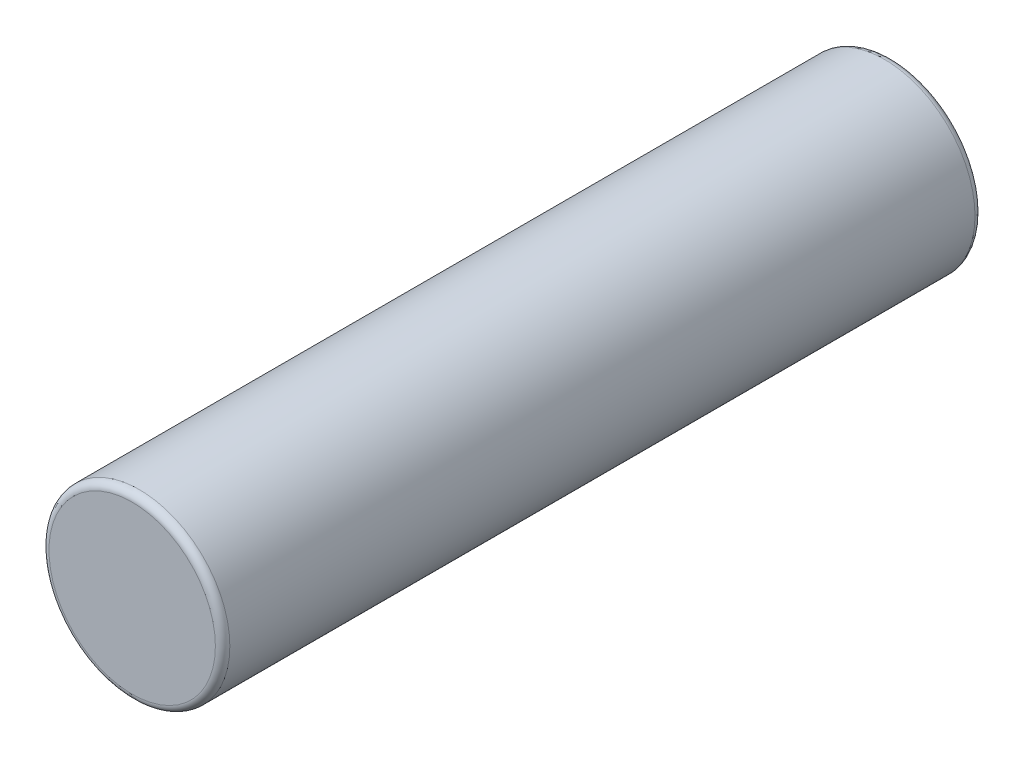
ISO-10303-21;
HEADER;
FILE_DESCRIPTION(('STEP AP214'),'2;1');
FILE_NAME('part.step','',(''),(''),'','','');
FILE_SCHEMA(('AUTOMOTIVE_DESIGN { 1 0 10303 214 1 1 1 1 }'));
ENDSEC;
DATA;
#1=APPLICATION_CONTEXT('core data for automotive mechanical design processes');
#2=APPLICATION_PROTOCOL_DEFINITION('international standard','automotive_design',2000,#1);
#3=PRODUCT_CONTEXT('',#1,'mechanical');
#4=PRODUCT('Part','Part','',(#3));
#5=PRODUCT_RELATED_PRODUCT_CATEGORY('part','',(#4));
#6=PRODUCT_DEFINITION_FORMATION('','',#4);
#7=PRODUCT_DEFINITION_CONTEXT('part definition',#1,'design');
#8=PRODUCT_DEFINITION('design','',#6,#7);
#9=PRODUCT_DEFINITION_SHAPE('','',#8);
#10=(LENGTH_UNIT() NAMED_UNIT(*) SI_UNIT(.MILLI.,.METRE.));
#11=(NAMED_UNIT(*) PLANE_ANGLE_UNIT() SI_UNIT($,.RADIAN.));
#12=(NAMED_UNIT(*) SI_UNIT($,.STERADIAN.) SOLID_ANGLE_UNIT());
#13=UNCERTAINTY_MEASURE_WITH_UNIT(LENGTH_MEASURE(1.E-05),#10,'distance_accuracy_value','');
#14=(GEOMETRIC_REPRESENTATION_CONTEXT(3) GLOBAL_UNCERTAINTY_ASSIGNED_CONTEXT((#13)) GLOBAL_UNIT_ASSIGNED_CONTEXT((#10,
#11,#12)) REPRESENTATION_CONTEXT('',''));
#15=CARTESIAN_POINT('',(0.,0.,0.));
#16=DIRECTION('',(0.,0.,1.));
#17=DIRECTION('',(1.,0.,0.));
#18=AXIS2_PLACEMENT_3D('',#15,#16,#17);
#19=CARTESIAN_POINT('',(0.,0.,10.5));
#20=DIRECTION('',(0.,0.,-1.));
#21=DIRECTION('',(-1.,0.,0.));
#22=AXIS2_PLACEMENT_3D('',#19,#20,#21);
#23=CYLINDRICAL_SURFACE('',#22,2.5);
#24=CARTESIAN_POINT('',(0.,0.,-10.3));
#25=DIRECTION('',(0.,0.,1.));
#26=DIRECTION('',(1.,0.,0.));
#27=AXIS2_PLACEMENT_3D('',#24,#25,#26);
#28=CIRCLE('',#27,2.5);
#29=CARTESIAN_POINT('',(-2.5,0.,-10.3));
#30=VERTEX_POINT('',#29);
#31=EDGE_CURVE('E43',#30,#30,#28,.T.);
#32=CARTESIAN_POINT('',(0.,0.,10.3));
#33=DIRECTION('',(0.,0.,1.));
#34=DIRECTION('',(1.,0.,0.));
#35=AXIS2_PLACEMENT_3D('',#32,#33,#34);
#36=CIRCLE('',#35,2.5);
#37=CARTESIAN_POINT('',(-2.5,0.,10.3));
#38=VERTEX_POINT('',#37);
#39=EDGE_CURVE('E47',#38,#38,#36,.F.);
#40=CARTESIAN_POINT('',(-2.5,0.,-10.3));
#41=CARTESIAN_POINT('',(-2.5,0.,-10.0854166666667));
#42=CARTESIAN_POINT('',(-2.5,0.,-9.87083333333334));
#43=CARTESIAN_POINT('',(-2.5,0.,-9.44166666666667));
#44=CARTESIAN_POINT('',(-2.5,0.,-9.22708333333333));
#45=CARTESIAN_POINT('',(-2.5,0.,-8.79791666666667));
#46=CARTESIAN_POINT('',(-2.5,0.,-8.58333333333334));
#47=CARTESIAN_POINT('',(-2.5,0.,-8.15416666666667));
#48=CARTESIAN_POINT('',(-2.5,0.,-7.93958333333333));
#49=CARTESIAN_POINT('',(-2.5,0.,-7.51041666666667));
#50=CARTESIAN_POINT('',(-2.5,0.,-7.29583333333334));
#51=CARTESIAN_POINT('',(-2.5,0.,-6.86666666666667));
#52=CARTESIAN_POINT('',(-2.5,0.,-6.65208333333333));
#53=CARTESIAN_POINT('',(-2.5,0.,-6.22291666666667));
#54=CARTESIAN_POINT('',(-2.5,0.,-6.00833333333334));
#55=CARTESIAN_POINT('',(-2.5,0.,-5.57916666666667));
#56=CARTESIAN_POINT('',(-2.5,0.,-5.36458333333333));
#57=CARTESIAN_POINT('',(-2.5,0.,-4.93541666666667));
#58=CARTESIAN_POINT('',(-2.5,0.,-4.72083333333334));
#59=CARTESIAN_POINT('',(-2.5,0.,-4.29166666666667));
#60=CARTESIAN_POINT('',(-2.5,0.,-4.07708333333334));
#61=CARTESIAN_POINT('',(-2.5,0.,-3.64791666666667));
#62=CARTESIAN_POINT('',(-2.5,0.,-3.43333333333334));
#63=CARTESIAN_POINT('',(-2.5,0.,-3.00416666666667));
#64=CARTESIAN_POINT('',(-2.5,0.,-2.78958333333334));
#65=CARTESIAN_POINT('',(-2.5,0.,-2.36041666666667));
#66=CARTESIAN_POINT('',(-2.5,0.,-2.14583333333334));
#67=CARTESIAN_POINT('',(-2.5,0.,-1.71666666666667));
#68=CARTESIAN_POINT('',(-2.5,0.,-1.50208333333334));
#69=CARTESIAN_POINT('',(-2.5,0.,-1.07291666666667));
#70=CARTESIAN_POINT('',(-2.5,0.,-0.858333333333335));
#71=CARTESIAN_POINT('',(-2.5,0.,-0.429166666666669));
#72=CARTESIAN_POINT('',(-2.5,0.,-0.214583333333335));
#73=CARTESIAN_POINT('',(-2.5,0.,0.214583333333332));
#74=CARTESIAN_POINT('',(-2.5,0.,0.429166666666665));
#75=CARTESIAN_POINT('',(-2.5,0.,0.858333333333332));
#76=CARTESIAN_POINT('',(-2.5,0.,1.07291666666667));
#77=CARTESIAN_POINT('',(-2.5,0.,1.50208333333333));
#78=CARTESIAN_POINT('',(-2.5,0.,1.71666666666667));
#79=CARTESIAN_POINT('',(-2.5,0.,2.14583333333333));
#80=CARTESIAN_POINT('',(-2.5,0.,2.36041666666667));
#81=CARTESIAN_POINT('',(-2.5,0.,2.78958333333333));
#82=CARTESIAN_POINT('',(-2.5,0.,3.00416666666667));
#83=CARTESIAN_POINT('',(-2.5,0.,3.43333333333333));
#84=CARTESIAN_POINT('',(-2.5,0.,3.64791666666667));
#85=CARTESIAN_POINT('',(-2.5,0.,4.07708333333333));
#86=CARTESIAN_POINT('',(-2.5,0.,4.29166666666667));
#87=CARTESIAN_POINT('',(-2.5,0.,4.72083333333333));
#88=CARTESIAN_POINT('',(-2.5,0.,4.93541666666666));
#89=CARTESIAN_POINT('',(-2.5,0.,5.36458333333333));
#90=CARTESIAN_POINT('',(-2.5,0.,5.57916666666667));
#91=CARTESIAN_POINT('',(-2.5,0.,6.00833333333333));
#92=CARTESIAN_POINT('',(-2.5,0.,6.22291666666666));
#93=CARTESIAN_POINT('',(-2.5,0.,6.65208333333333));
#94=CARTESIAN_POINT('',(-2.5,0.,6.86666666666667));
#95=CARTESIAN_POINT('',(-2.5,0.,7.29583333333333));
#96=CARTESIAN_POINT('',(-2.5,0.,7.51041666666666));
#97=CARTESIAN_POINT('',(-2.5,0.,7.93958333333333));
#98=CARTESIAN_POINT('',(-2.5,0.,8.15416666666667));
#99=CARTESIAN_POINT('',(-2.5,0.,8.58333333333333));
#100=CARTESIAN_POINT('',(-2.5,0.,8.79791666666667));
#101=CARTESIAN_POINT('',(-2.5,0.,9.22708333333333));
#102=CARTESIAN_POINT('',(-2.5,0.,9.44166666666667));
#103=CARTESIAN_POINT('',(-2.5,0.,9.87083333333333));
#104=CARTESIAN_POINT('',(-2.5,0.,10.0854166666667));
#105=CARTESIAN_POINT('',(-2.5,0.,10.3));
#106=B_SPLINE_CURVE_WITH_KNOTS('',3,(#40,#41,#42,#43,#44,#45,#46,#47,#48,#49,#50,#51,#52,#53,
#54,#55,#56,#57,#58,#59,#60,#61,#62,#63,#64,#65,#66,#67,#68,#69,#70,#71,#72,#73,#74,#75,#76,#77,
#78,#79,#80,#81,#82,#83,#84,#85,#86,#87,#88,#89,#90,#91,#92,#93,#94,#95,#96,#97,#98,#99,#100,
#101,#102,#103,#104,#105),.UNSPECIFIED.,.F.,.F.,(4,2,2,2,2,2,2,2,2,2,2,2,2,2,2,2,2,2,2,2,2,2,2,
2,2,2,2,2,2,2,2,2,4),(0.,0.643749999999998,1.2875,1.93125,2.575,3.21875,3.8625,4.50625,5.15,
5.79375,6.4375,7.08125,7.725,8.36875,9.0125,9.65625,10.3,10.94375,11.5875,12.23125,12.875,
13.51875,14.1625,14.80625,15.45,16.09375,16.7375,17.38125,18.025,18.66875,19.3125,19.95625,
20.6),.UNSPECIFIED.);
#107=EDGE_CURVE('BSEAM33',#30,#38,#106,.T.);
#108=ORIENTED_EDGE('',*,*,#31,.T.);
#109=ORIENTED_EDGE('',*,*,#39,.T.);
#110=ORIENTED_EDGE('',*,*,#107,.T.);
#111=ORIENTED_EDGE('',*,*,#107,.F.);
#112=EDGE_LOOP('',(#108,#110,#109,#111));
#113=FACE_BOUND('',#112,.T.);
#114=ADVANCED_FACE('F33',(#113),#23,.T.);
#115=CARTESIAN_POINT('',(0.,0.,10.5));
#116=DIRECTION('',(0.,0.,1.));
#117=DIRECTION('',(1.,0.,0.));
#118=AXIS2_PLACEMENT_3D('',#115,#116,#117);
#119=PLANE('',#118);
#120=CARTESIAN_POINT('',(0.,0.,10.5));
#121=DIRECTION('',(0.,0.,1.));
#122=DIRECTION('',(1.,0.,0.));
#123=AXIS2_PLACEMENT_3D('',#120,#121,#122);
#124=CIRCLE('',#123,2.3);
#125=CARTESIAN_POINT('',(2.3,0.,10.5));
#126=VERTEX_POINT('',#125);
#127=EDGE_CURVE('E10',#126,#126,#124,.T.);
#128=ORIENTED_EDGE('',*,*,#127,.T.);
#129=EDGE_LOOP('',(#128));
#130=FACE_BOUND('',#129,.T.);
#131=ADVANCED_FACE('F66',(#130),#119,.T.);
#132=CARTESIAN_POINT('',(0.,0.,-10.5));
#133=DIRECTION('',(0.,0.,1.));
#134=DIRECTION('',(1.,0.,0.));
#135=AXIS2_PLACEMENT_3D('',#132,#133,#134);
#136=PLANE('',#135);
#137=CARTESIAN_POINT('',(0.,0.,-10.5));
#138=DIRECTION('',(0.,0.,1.));
#139=DIRECTION('',(1.,0.,0.));
#140=AXIS2_PLACEMENT_3D('',#137,#138,#139);
#141=CIRCLE('',#140,2.3);
#142=CARTESIAN_POINT('',(2.3,0.,-10.5));
#143=VERTEX_POINT('',#142);
#144=EDGE_CURVE('E39',#143,#143,#141,.F.);
#145=ORIENTED_EDGE('',*,*,#144,.T.);
#146=EDGE_LOOP('',(#145));
#147=FACE_BOUND('',#146,.T.);
#148=ADVANCED_FACE('F62',(#147),#136,.F.);
#149=CARTESIAN_POINT('',(0.,0.,-10.3));
#150=DIRECTION('',(0.,0.,1.));
#151=DIRECTION('',(1.,0.,0.));
#152=AXIS2_PLACEMENT_3D('',#149,#150,#151);
#153=TOROIDAL_SURFACE('',#152,2.3,0.2);
#154=ORIENTED_EDGE('',*,*,#144,.F.);
#155=EDGE_LOOP('',(#154));
#156=FACE_BOUND('',#155,.T.);
#157=ORIENTED_EDGE('',*,*,#31,.F.);
#158=EDGE_LOOP('',(#157));
#159=FACE_BOUND('',#158,.T.);
#160=ADVANCED_FACE('F57',(#156,#159),#153,.T.);
#161=CARTESIAN_POINT('',(0.,0.,10.3));
#162=DIRECTION('',(0.,0.,1.));
#163=DIRECTION('',(1.,0.,0.));
#164=AXIS2_PLACEMENT_3D('',#161,#162,#163);
#165=TOROIDAL_SURFACE('',#164,2.3,0.2);
#166=ORIENTED_EDGE('',*,*,#39,.F.);
#167=EDGE_LOOP('',(#166));
#168=FACE_BOUND('',#167,.T.);
#169=ORIENTED_EDGE('',*,*,#127,.F.);
#170=EDGE_LOOP('',(#169));
#171=FACE_BOUND('',#170,.T.);
#172=ADVANCED_FACE('F54',(#168,#171),#165,.T.);
#173=CLOSED_SHELL('',(#114,#131,#148,#160,#172));
#174=MANIFOLD_SOLID_BREP('B2',#173);
#175=ADVANCED_BREP_SHAPE_REPRESENTATION('',(#18,#174),#14);
#176=SHAPE_DEFINITION_REPRESENTATION(#9,#175);
ENDSEC;
END-ISO-10303-21;
